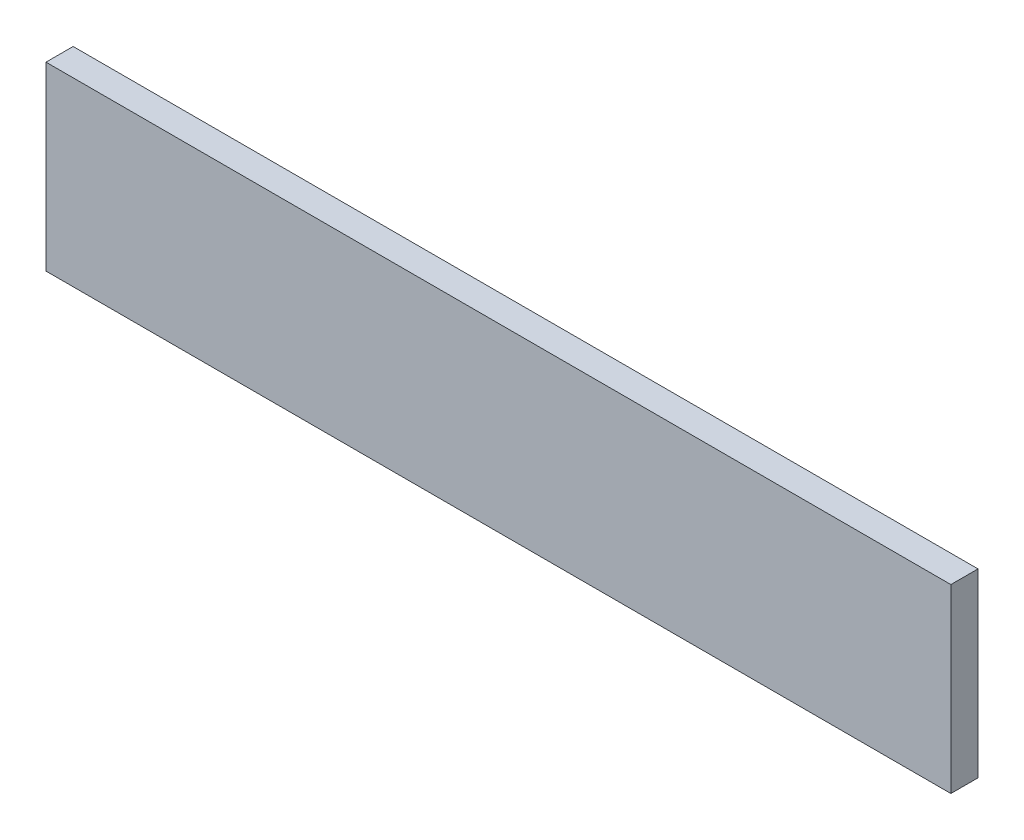
ISO-10303-21;
HEADER;
FILE_DESCRIPTION(('STEP AP214'),'2;1');
FILE_NAME('part.step','',(''),(''),'','','');
FILE_SCHEMA(('AUTOMOTIVE_DESIGN { 1 0 10303 214 1 1 1 1 }'));
ENDSEC;
DATA;
#1=APPLICATION_CONTEXT('core data for automotive mechanical design processes');
#2=APPLICATION_PROTOCOL_DEFINITION('international standard','automotive_design',2000,#1);
#3=PRODUCT_CONTEXT('',#1,'mechanical');
#4=PRODUCT('Part','Part','',(#3));
#5=PRODUCT_RELATED_PRODUCT_CATEGORY('part','',(#4));
#6=PRODUCT_DEFINITION_FORMATION('','',#4);
#7=PRODUCT_DEFINITION_CONTEXT('part definition',#1,'design');
#8=PRODUCT_DEFINITION('design','',#6,#7);
#9=PRODUCT_DEFINITION_SHAPE('','',#8);
#10=(LENGTH_UNIT() NAMED_UNIT(*) SI_UNIT(.MILLI.,.METRE.));
#11=(NAMED_UNIT(*) PLANE_ANGLE_UNIT() SI_UNIT($,.RADIAN.));
#12=(NAMED_UNIT(*) SI_UNIT($,.STERADIAN.) SOLID_ANGLE_UNIT());
#13=UNCERTAINTY_MEASURE_WITH_UNIT(LENGTH_MEASURE(1.E-05),#10,'distance_accuracy_value','');
#14=(GEOMETRIC_REPRESENTATION_CONTEXT(3) GLOBAL_UNCERTAINTY_ASSIGNED_CONTEXT((#13)) GLOBAL_UNIT_ASSIGNED_CONTEXT((#10,
#11,#12)) REPRESENTATION_CONTEXT('',''));
#15=CARTESIAN_POINT('',(0.,0.,0.));
#16=DIRECTION('',(0.,0.,1.));
#17=DIRECTION('',(1.,0.,0.));
#18=AXIS2_PLACEMENT_3D('',#15,#16,#17);
#19=CARTESIAN_POINT('',(141.,-36.4613160518445,3.));
#20=DIRECTION('',(-1.,0.,0.));
#21=DIRECTION('',(0.,0.,1.));
#22=AXIS2_PLACEMENT_3D('',#19,#20,#21);
#23=PLANE('',#22);
#24=DIRECTION('',(0.,1.,0.));
#25=VECTOR('',#24,1.);
#26=CARTESIAN_POINT('',(141.,-36.4613160518445,0.));
#27=LINE('',#26,#25);
#28=CARTESIAN_POINT('',(141.,-36.4613160518445,0.));
#29=VERTEX_POINT('',#28);
#30=CARTESIAN_POINT('',(141.,-16.4613160518445,0.));
#31=VERTEX_POINT('',#30);
#32=EDGE_CURVE('E74',#29,#31,#27,.T.);
#33=ORIENTED_EDGE('',*,*,#32,.T.);
#34=DIRECTION('',(0.,0.,-1.));
#35=VECTOR('',#34,1.);
#36=CARTESIAN_POINT('',(141.,-16.4613160518445,3.));
#37=LINE('',#36,#35);
#38=CARTESIAN_POINT('',(141.,-16.4613160518445,3.));
#39=VERTEX_POINT('',#38);
#40=EDGE_CURVE('E11',#39,#31,#37,.T.);
#41=ORIENTED_EDGE('',*,*,#40,.F.);
#42=DIRECTION('',(0.,1.,0.));
#43=VECTOR('',#42,1.);
#44=CARTESIAN_POINT('',(141.,-36.4613160518445,3.));
#45=LINE('',#44,#43);
#46=CARTESIAN_POINT('',(141.,-36.4613160518445,3.));
#47=VERTEX_POINT('',#46);
#48=EDGE_CURVE('E92',#47,#39,#45,.T.);
#49=ORIENTED_EDGE('',*,*,#48,.F.);
#50=DIRECTION('',(0.,0.,-1.));
#51=VECTOR('',#50,1.);
#52=CARTESIAN_POINT('',(141.,-36.4613160518445,3.));
#53=LINE('',#52,#51);
#54=EDGE_CURVE('E86',#47,#29,#53,.T.);
#55=ORIENTED_EDGE('',*,*,#54,.T.);
#56=EDGE_LOOP('',(#33,#41,#49,#55));
#57=FACE_BOUND('',#56,.T.);
#58=ADVANCED_FACE('F30',(#57),#23,.F.);
#59=CARTESIAN_POINT('',(141.,-16.4613160518445,3.));
#60=DIRECTION('',(0.,-1.,0.));
#61=DIRECTION('',(1.,0.,0.));
#62=AXIS2_PLACEMENT_3D('',#59,#60,#61);
#63=PLANE('',#62);
#64=DIRECTION('',(-1.,0.,0.));
#65=VECTOR('',#64,1.);
#66=CARTESIAN_POINT('',(141.,-16.4613160518445,0.));
#67=LINE('',#66,#65);
#68=CARTESIAN_POINT('',(41.,-16.4613160518445,0.));
#69=VERTEX_POINT('',#68);
#70=EDGE_CURVE('E70',#31,#69,#67,.T.);
#71=ORIENTED_EDGE('',*,*,#70,.T.);
#72=DIRECTION('',(0.,0.,-1.));
#73=VECTOR('',#72,1.);
#74=CARTESIAN_POINT('',(41.,-16.4613160518445,3.));
#75=LINE('',#74,#73);
#76=CARTESIAN_POINT('',(41.,-16.4613160518445,3.));
#77=VERTEX_POINT('',#76);
#78=EDGE_CURVE('E37',#77,#69,#75,.T.);
#79=ORIENTED_EDGE('',*,*,#78,.F.);
#80=DIRECTION('',(-1.,0.,0.));
#81=VECTOR('',#80,1.);
#82=CARTESIAN_POINT('',(141.,-16.4613160518445,3.));
#83=LINE('',#82,#81);
#84=EDGE_CURVE('E82',#39,#77,#83,.T.);
#85=ORIENTED_EDGE('',*,*,#84,.F.);
#86=ORIENTED_EDGE('',*,*,#40,.T.);
#87=EDGE_LOOP('',(#71,#79,#85,#86));
#88=FACE_BOUND('',#87,.T.);
#89=ADVANCED_FACE('F81',(#88),#63,.F.);
#90=CARTESIAN_POINT('',(41.,-36.4613160518445,3.));
#91=DIRECTION('',(1.,0.,0.));
#92=DIRECTION('',(0.,0.,-1.));
#93=AXIS2_PLACEMENT_3D('',#90,#91,#92);
#94=PLANE('',#93);
#95=DIRECTION('',(0.,-1.,0.));
#96=VECTOR('',#95,1.);
#97=CARTESIAN_POINT('',(41.,-36.4613160518445,0.));
#98=LINE('',#97,#96);
#99=CARTESIAN_POINT('',(41.,-36.4613160518445,0.));
#100=VERTEX_POINT('',#99);
#101=EDGE_CURVE('E75',#69,#100,#98,.T.);
#102=ORIENTED_EDGE('',*,*,#101,.T.);
#103=DIRECTION('',(0.,0.,-1.));
#104=VECTOR('',#103,1.);
#105=CARTESIAN_POINT('',(41.,-36.4613160518445,3.));
#106=LINE('',#105,#104);
#107=CARTESIAN_POINT('',(41.,-36.4613160518445,3.));
#108=VERTEX_POINT('',#107);
#109=EDGE_CURVE('E98',#108,#100,#106,.T.);
#110=ORIENTED_EDGE('',*,*,#109,.F.);
#111=DIRECTION('',(0.,-1.,0.));
#112=VECTOR('',#111,1.);
#113=CARTESIAN_POINT('',(41.,-36.4613160518445,3.));
#114=LINE('',#113,#112);
#115=EDGE_CURVE('E49',#77,#108,#114,.T.);
#116=ORIENTED_EDGE('',*,*,#115,.F.);
#117=ORIENTED_EDGE('',*,*,#78,.T.);
#118=EDGE_LOOP('',(#102,#110,#116,#117));
#119=FACE_BOUND('',#118,.T.);
#120=ADVANCED_FACE('F101',(#119),#94,.F.);
#121=CARTESIAN_POINT('',(141.,-36.4613160518445,3.));
#122=DIRECTION('',(0.,1.,0.));
#123=DIRECTION('',(-1.,0.,0.));
#124=AXIS2_PLACEMENT_3D('',#121,#122,#123);
#125=PLANE('',#124);
#126=DIRECTION('',(1.,0.,0.));
#127=VECTOR('',#126,1.);
#128=CARTESIAN_POINT('',(141.,-36.4613160518445,0.));
#129=LINE('',#128,#127);
#130=EDGE_CURVE('E90',#100,#29,#129,.T.);
#131=ORIENTED_EDGE('',*,*,#130,.T.);
#132=ORIENTED_EDGE('',*,*,#54,.F.);
#133=DIRECTION('',(1.,0.,0.));
#134=VECTOR('',#133,1.);
#135=CARTESIAN_POINT('',(141.,-36.4613160518445,3.));
#136=LINE('',#135,#134);
#137=EDGE_CURVE('E44',#108,#47,#136,.T.);
#138=ORIENTED_EDGE('',*,*,#137,.F.);
#139=ORIENTED_EDGE('',*,*,#109,.T.);
#140=EDGE_LOOP('',(#131,#132,#138,#139));
#141=FACE_BOUND('',#140,.T.);
#142=ADVANCED_FACE('F103',(#141),#125,.F.);
#143=CARTESIAN_POINT('',(141.,-16.4613160518445,3.));
#144=DIRECTION('',(0.,0.,1.));
#145=DIRECTION('',(1.,0.,0.));
#146=AXIS2_PLACEMENT_3D('',#143,#144,#145);
#147=PLANE('',#146);
#148=ORIENTED_EDGE('',*,*,#48,.T.);
#149=ORIENTED_EDGE('',*,*,#84,.T.);
#150=ORIENTED_EDGE('',*,*,#115,.T.);
#151=ORIENTED_EDGE('',*,*,#137,.T.);
#152=EDGE_LOOP('',(#148,#149,#150,#151));
#153=FACE_BOUND('',#152,.T.);
#154=ADVANCED_FACE('F104',(#153),#147,.T.);
#155=CARTESIAN_POINT('',(141.,-16.4613160518445,0.));
#156=DIRECTION('',(0.,0.,1.));
#157=DIRECTION('',(1.,0.,0.));
#158=AXIS2_PLACEMENT_3D('',#155,#156,#157);
#159=PLANE('',#158);
#160=ORIENTED_EDGE('',*,*,#32,.F.);
#161=ORIENTED_EDGE('',*,*,#130,.F.);
#162=ORIENTED_EDGE('',*,*,#101,.F.);
#163=ORIENTED_EDGE('',*,*,#70,.F.);
#164=EDGE_LOOP('',(#160,#161,#162,#163));
#165=FACE_BOUND('',#164,.T.);
#166=ADVANCED_FACE('F71',(#165),#159,.F.);
#167=CLOSED_SHELL('',(#58,#89,#120,#142,#154,#166));
#168=MANIFOLD_SOLID_BREP('B2',#167);
#169=ADVANCED_BREP_SHAPE_REPRESENTATION('',(#18,#168),#14);
#170=SHAPE_DEFINITION_REPRESENTATION(#9,#169);
ENDSEC;
END-ISO-10303-21;
